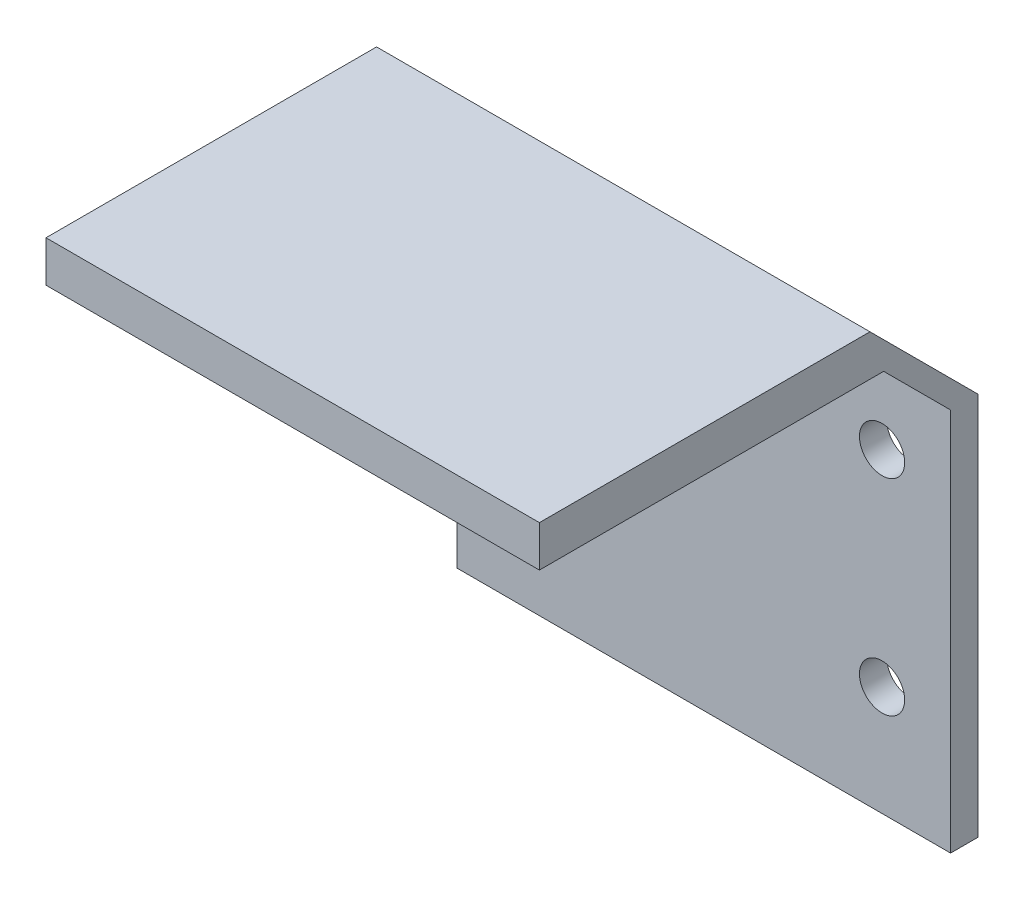
ISO-10303-21;
HEADER;
FILE_DESCRIPTION(('STEP AP214'),'2;1');
FILE_NAME('part.step','',(''),(''),'','','');
FILE_SCHEMA(('AUTOMOTIVE_DESIGN { 1 0 10303 214 1 1 1 1 }'));
ENDSEC;
DATA;
#1=APPLICATION_CONTEXT('core data for automotive mechanical design processes');
#2=APPLICATION_PROTOCOL_DEFINITION('international standard','automotive_design',2000,#1);
#3=PRODUCT_CONTEXT('',#1,'mechanical');
#4=PRODUCT('Part','Part','',(#3));
#5=PRODUCT_RELATED_PRODUCT_CATEGORY('part','',(#4));
#6=PRODUCT_DEFINITION_FORMATION('','',#4);
#7=PRODUCT_DEFINITION_CONTEXT('part definition',#1,'design');
#8=PRODUCT_DEFINITION('design','',#6,#7);
#9=PRODUCT_DEFINITION_SHAPE('','',#8);
#10=(LENGTH_UNIT() NAMED_UNIT(*) SI_UNIT(.MILLI.,.METRE.));
#11=(NAMED_UNIT(*) PLANE_ANGLE_UNIT() SI_UNIT($,.RADIAN.));
#12=(NAMED_UNIT(*) SI_UNIT($,.STERADIAN.) SOLID_ANGLE_UNIT());
#13=UNCERTAINTY_MEASURE_WITH_UNIT(LENGTH_MEASURE(1.E-05),#10,'distance_accuracy_value','');
#14=(GEOMETRIC_REPRESENTATION_CONTEXT(3) GLOBAL_UNCERTAINTY_ASSIGNED_CONTEXT((#13)) GLOBAL_UNIT_ASSIGNED_CONTEXT((#10,
#11,#12)) REPRESENTATION_CONTEXT('',''));
#15=CARTESIAN_POINT('',(0.,0.,0.));
#16=DIRECTION('',(0.,0.,1.));
#17=DIRECTION('',(1.,0.,0.));
#18=AXIS2_PLACEMENT_3D('',#15,#16,#17);
#19=CARTESIAN_POINT('',(0.,0.,2.));
#20=DIRECTION('',(1.,0.,0.));
#21=DIRECTION('',(0.,0.,-1.));
#22=AXIS2_PLACEMENT_3D('',#19,#20,#21);
#23=PLANE('',#22);
#24=DIRECTION('',(0.,-1.,0.));
#25=VECTOR('',#24,1.);
#26=CARTESIAN_POINT('',(0.,0.,0.));
#27=LINE('',#26,#25);
#28=CARTESIAN_POINT('',(0.,28.,0.));
#29=VERTEX_POINT('',#28);
#30=CARTESIAN_POINT('',(0.,0.,0.));
#31=VERTEX_POINT('',#30);
#32=EDGE_CURVE('E79',#29,#31,#27,.T.);
#33=ORIENTED_EDGE('',*,*,#32,.T.);
#34=DIRECTION('',(0.,0.,-1.));
#35=VECTOR('',#34,1.);
#36=CARTESIAN_POINT('',(0.,0.,2.));
#37=LINE('',#36,#35);
#38=CARTESIAN_POINT('',(0.,0.,2.));
#39=VERTEX_POINT('',#38);
#40=EDGE_CURVE('E11',#39,#31,#37,.T.);
#41=ORIENTED_EDGE('',*,*,#40,.F.);
#42=DIRECTION('',(0.,-1.,0.));
#43=VECTOR('',#42,1.);
#44=CARTESIAN_POINT('',(0.,0.,2.));
#45=LINE('',#44,#43);
#46=CARTESIAN_POINT('',(0.,28.,2.));
#47=VERTEX_POINT('',#46);
#48=EDGE_CURVE('E132',#47,#39,#45,.T.);
#49=ORIENTED_EDGE('',*,*,#48,.F.);
#50=DIRECTION('',(0.,-0.707106781186549,-0.707106781186546));
#51=VECTOR('',#50,1.);
#52=CARTESIAN_POINT('',(0.,32.8821219376509,6.88212193765087));
#53=LINE('',#52,#51);
#54=CARTESIAN_POINT('',(0.,32.8821219376509,6.88212193765087));
#55=VERTEX_POINT('',#54);
#56=EDGE_CURVE('E116',#55,#47,#53,.T.);
#57=ORIENTED_EDGE('',*,*,#56,.F.);
#58=DIRECTION('',(0.,0.,-1.));
#59=VECTOR('',#58,1.);
#60=CARTESIAN_POINT('',(0.,32.8821219376509,6.88212193765087));
#61=LINE('',#60,#59);
#62=CARTESIAN_POINT('',(0.,32.8821219376509,32.));
#63=VERTEX_POINT('',#62);
#64=EDGE_CURVE('E129',#63,#55,#61,.T.);
#65=ORIENTED_EDGE('',*,*,#64,.F.);
#66=DIRECTION('',(0.,-1.,0.));
#67=VECTOR('',#66,1.);
#68=CARTESIAN_POINT('',(0.,32.8821219376509,32.));
#69=LINE('',#68,#67);
#70=CARTESIAN_POINT('',(0.,35.8821219376509,32.));
#71=VERTEX_POINT('',#70);
#72=EDGE_CURVE('E124',#71,#63,#69,.T.);
#73=ORIENTED_EDGE('',*,*,#72,.F.);
#74=DIRECTION('',(0.,0.,1.));
#75=VECTOR('',#74,1.);
#76=CARTESIAN_POINT('',(0.,35.8821219376509,32.));
#77=LINE('',#76,#75);
#78=CARTESIAN_POINT('',(0.,35.8821219376509,7.88212193765087));
#79=VERTEX_POINT('',#78);
#80=EDGE_CURVE('E148',#79,#71,#77,.T.);
#81=ORIENTED_EDGE('',*,*,#80,.F.);
#82=DIRECTION('',(0.,0.707106781186549,0.707106781186546));
#83=VECTOR('',#82,1.);
#84=CARTESIAN_POINT('',(0.,35.8821219376509,7.88212193765087));
#85=LINE('',#84,#83);
#86=EDGE_CURVE('E133',#29,#79,#85,.T.);
#87=ORIENTED_EDGE('',*,*,#86,.F.);
#88=EDGE_LOOP('',(#33,#41,#49,#57,#65,#73,#81,#87));
#89=FACE_BOUND('',#88,.T.);
#90=ADVANCED_FACE('F41',(#89),#23,.F.);
#91=CARTESIAN_POINT('',(0.,0.,2.));
#92=DIRECTION('',(0.,1.,0.));
#93=DIRECTION('',(0.,0.,1.));
#94=AXIS2_PLACEMENT_3D('',#91,#92,#93);
#95=PLANE('',#94);
#96=DIRECTION('',(1.,0.,0.));
#97=VECTOR('',#96,1.);
#98=CARTESIAN_POINT('',(0.,0.,0.));
#99=LINE('',#98,#97);
#100=CARTESIAN_POINT('',(36.,0.,0.));
#101=VERTEX_POINT('',#100);
#102=EDGE_CURVE('E72',#31,#101,#99,.T.);
#103=ORIENTED_EDGE('',*,*,#102,.T.);
#104=DIRECTION('',(0.,0.,-1.));
#105=VECTOR('',#104,1.);
#106=CARTESIAN_POINT('',(36.,0.,2.));
#107=LINE('',#106,#105);
#108=CARTESIAN_POINT('',(36.,0.,2.));
#109=VERTEX_POINT('',#108);
#110=EDGE_CURVE('E50',#109,#101,#107,.T.);
#111=ORIENTED_EDGE('',*,*,#110,.F.);
#112=DIRECTION('',(1.,0.,0.));
#113=VECTOR('',#112,1.);
#114=CARTESIAN_POINT('',(0.,0.,2.));
#115=LINE('',#114,#113);
#116=EDGE_CURVE('E84',#39,#109,#115,.T.);
#117=ORIENTED_EDGE('',*,*,#116,.F.);
#118=ORIENTED_EDGE('',*,*,#40,.T.);
#119=EDGE_LOOP('',(#103,#111,#117,#118));
#120=FACE_BOUND('',#119,.T.);
#121=ADVANCED_FACE('F229',(#120),#95,.F.);
#122=CARTESIAN_POINT('',(36.,0.,2.));
#123=DIRECTION('',(-1.,0.,0.));
#124=DIRECTION('',(0.,0.,1.));
#125=AXIS2_PLACEMENT_3D('',#122,#123,#124);
#126=PLANE('',#125);
#127=DIRECTION('',(0.,1.,0.));
#128=VECTOR('',#127,1.);
#129=CARTESIAN_POINT('',(36.,0.,0.));
#130=LINE('',#129,#128);
#131=CARTESIAN_POINT('',(36.,28.,0.));
#132=VERTEX_POINT('',#131);
#133=EDGE_CURVE('E172',#101,#132,#130,.T.);
#134=ORIENTED_EDGE('',*,*,#133,.T.);
#135=DIRECTION('',(0.,0.707106781186549,0.707106781186546));
#136=VECTOR('',#135,1.);
#137=CARTESIAN_POINT('',(36.,35.8821219376509,7.88212193765087));
#138=LINE('',#137,#136);
#139=CARTESIAN_POINT('',(36.,35.8821219376509,7.88212193765087));
#140=VERTEX_POINT('',#139);
#141=EDGE_CURVE('E155',#132,#140,#138,.T.);
#142=ORIENTED_EDGE('',*,*,#141,.T.);
#143=DIRECTION('',(0.,0.,1.));
#144=VECTOR('',#143,1.);
#145=CARTESIAN_POINT('',(36.,35.8821219376509,32.));
#146=LINE('',#145,#144);
#147=CARTESIAN_POINT('',(36.,35.8821219376509,32.));
#148=VERTEX_POINT('',#147);
#149=EDGE_CURVE('E140',#140,#148,#146,.T.);
#150=ORIENTED_EDGE('',*,*,#149,.T.);
#151=DIRECTION('',(0.,-1.,0.));
#152=VECTOR('',#151,1.);
#153=CARTESIAN_POINT('',(36.,32.8821219376509,32.));
#154=LINE('',#153,#152);
#155=CARTESIAN_POINT('',(36.,32.8821219376509,32.));
#156=VERTEX_POINT('',#155);
#157=EDGE_CURVE('E137',#148,#156,#154,.T.);
#158=ORIENTED_EDGE('',*,*,#157,.T.);
#159=DIRECTION('',(0.,0.,-1.));
#160=VECTOR('',#159,1.);
#161=CARTESIAN_POINT('',(36.,32.8821219376509,6.88212193765087));
#162=LINE('',#161,#160);
#163=CARTESIAN_POINT('',(36.,32.8821219376509,6.88212193765087));
#164=VERTEX_POINT('',#163);
#165=EDGE_CURVE('E152',#156,#164,#162,.T.);
#166=ORIENTED_EDGE('',*,*,#165,.T.);
#167=DIRECTION('',(0.,-0.707106781186549,-0.707106781186546));
#168=VECTOR('',#167,1.);
#169=CARTESIAN_POINT('',(36.,32.8821219376509,6.88212193765087));
#170=LINE('',#169,#168);
#171=CARTESIAN_POINT('',(36.,28.,2.));
#172=VERTEX_POINT('',#171);
#173=EDGE_CURVE('E118',#164,#172,#170,.T.);
#174=ORIENTED_EDGE('',*,*,#173,.T.);
#175=DIRECTION('',(0.,1.,0.));
#176=VECTOR('',#175,1.);
#177=CARTESIAN_POINT('',(36.,0.,2.));
#178=LINE('',#177,#176);
#179=EDGE_CURVE('E167',#109,#172,#178,.T.);
#180=ORIENTED_EDGE('',*,*,#179,.F.);
#181=ORIENTED_EDGE('',*,*,#110,.T.);
#182=EDGE_LOOP('',(#134,#142,#150,#158,#166,#174,#180,#181));
#183=FACE_BOUND('',#182,.T.);
#184=ADVANCED_FACE('F224',(#183),#126,.F.);
#185=CARTESIAN_POINT('',(0.,0.,2.));
#186=DIRECTION('',(0.,0.,-1.));
#187=DIRECTION('',(-1.,0.,0.));
#188=AXIS2_PLACEMENT_3D('',#185,#186,#187);
#189=PLANE('',#188);
#190=CARTESIAN_POINT('',(31.0000000000002,8.,2.));
#191=DIRECTION('',(0.,0.,1.));
#192=DIRECTION('',(1.,0.,0.));
#193=AXIS2_PLACEMENT_3D('',#190,#191,#192);
#194=CIRCLE('',#193,1.65);
#195=CARTESIAN_POINT('',(32.6500000000002,8.,2.));
#196=VERTEX_POINT('',#195);
#197=EDGE_CURVE('E217',#196,#196,#194,.T.);
#198=ORIENTED_EDGE('',*,*,#197,.F.);
#199=EDGE_LOOP('',(#198));
#200=FACE_BOUND('',#199,.T.);
#201=CARTESIAN_POINT('',(6.00000000000015,7.99999999999983,2.));
#202=DIRECTION('',(0.,0.,1.));
#203=DIRECTION('',(1.,0.,0.));
#204=AXIS2_PLACEMENT_3D('',#201,#202,#203);
#205=CIRCLE('',#204,1.65);
#206=CARTESIAN_POINT('',(7.65000000000015,7.99999999999983,2.));
#207=VERTEX_POINT('',#206);
#208=EDGE_CURVE('E212',#207,#207,#205,.T.);
#209=ORIENTED_EDGE('',*,*,#208,.F.);
#210=EDGE_LOOP('',(#209));
#211=FACE_BOUND('',#210,.T.);
#212=CARTESIAN_POINT('',(5.99999999999999,22.9999999999998,2.));
#213=DIRECTION('',(0.,0.,1.));
#214=DIRECTION('',(1.,0.,0.));
#215=AXIS2_PLACEMENT_3D('',#212,#213,#214);
#216=CIRCLE('',#215,1.65);
#217=CARTESIAN_POINT('',(7.64999999999999,22.9999999999998,2.));
#218=VERTEX_POINT('',#217);
#219=EDGE_CURVE('E210',#218,#218,#216,.T.);
#220=ORIENTED_EDGE('',*,*,#219,.F.);
#221=EDGE_LOOP('',(#220));
#222=FACE_BOUND('',#221,.T.);
#223=CARTESIAN_POINT('',(31.,23.,2.));
#224=DIRECTION('',(0.,0.,1.));
#225=DIRECTION('',(1.,0.,0.));
#226=AXIS2_PLACEMENT_3D('',#223,#224,#225);
#227=CIRCLE('',#226,1.65);
#228=CARTESIAN_POINT('',(32.65,23.,2.));
#229=VERTEX_POINT('',#228);
#230=EDGE_CURVE('E143',#229,#229,#227,.T.);
#231=ORIENTED_EDGE('',*,*,#230,.F.);
#232=EDGE_LOOP('',(#231));
#233=FACE_BOUND('',#232,.T.);
#234=ORIENTED_EDGE('',*,*,#48,.T.);
#235=ORIENTED_EDGE('',*,*,#116,.T.);
#236=ORIENTED_EDGE('',*,*,#179,.T.);
#237=DIRECTION('',(-1.,0.,0.));
#238=VECTOR('',#237,1.);
#239=CARTESIAN_POINT('',(0.,28.,2.));
#240=LINE('',#239,#238);
#241=EDGE_CURVE('E59',#172,#47,#240,.T.);
#242=ORIENTED_EDGE('',*,*,#241,.T.);
#243=EDGE_LOOP('',(#234,#235,#236,#242));
#244=FACE_BOUND('',#243,.T.);
#245=ADVANCED_FACE('F195',(#200,#211,#222,#233,#244),#189,.F.);
#246=CARTESIAN_POINT('',(0.,0.,0.));
#247=DIRECTION('',(0.,0.,-1.));
#248=DIRECTION('',(-1.,0.,0.));
#249=AXIS2_PLACEMENT_3D('',#246,#247,#248);
#250=PLANE('',#249);
#251=CARTESIAN_POINT('',(31.0000000000002,8.,0.));
#252=DIRECTION('',(0.,0.,-1.));
#253=DIRECTION('',(-1.,0.,0.));
#254=AXIS2_PLACEMENT_3D('',#251,#252,#253);
#255=CIRCLE('',#254,1.65);
#256=CARTESIAN_POINT('',(29.3500000000002,8.,0.));
#257=VERTEX_POINT('',#256);
#258=EDGE_CURVE('E44',#257,#257,#255,.T.);
#259=ORIENTED_EDGE('',*,*,#258,.F.);
#260=EDGE_LOOP('',(#259));
#261=FACE_BOUND('',#260,.T.);
#262=CARTESIAN_POINT('',(6.00000000000015,7.99999999999983,0.));
#263=DIRECTION('',(0.,0.,-1.));
#264=DIRECTION('',(-1.,0.,0.));
#265=AXIS2_PLACEMENT_3D('',#262,#263,#264);
#266=CIRCLE('',#265,1.65);
#267=CARTESIAN_POINT('',(4.35000000000015,7.99999999999983,0.));
#268=VERTEX_POINT('',#267);
#269=EDGE_CURVE('E182',#268,#268,#266,.T.);
#270=ORIENTED_EDGE('',*,*,#269,.F.);
#271=EDGE_LOOP('',(#270));
#272=FACE_BOUND('',#271,.T.);
#273=CARTESIAN_POINT('',(5.99999999999999,22.9999999999998,0.));
#274=DIRECTION('',(0.,0.,-1.));
#275=DIRECTION('',(-1.,0.,0.));
#276=AXIS2_PLACEMENT_3D('',#273,#274,#275);
#277=CIRCLE('',#276,1.65);
#278=CARTESIAN_POINT('',(4.35,22.9999999999998,0.));
#279=VERTEX_POINT('',#278);
#280=EDGE_CURVE('E180',#279,#279,#277,.T.);
#281=ORIENTED_EDGE('',*,*,#280,.F.);
#282=EDGE_LOOP('',(#281));
#283=FACE_BOUND('',#282,.T.);
#284=CARTESIAN_POINT('',(31.,23.,0.));
#285=DIRECTION('',(0.,0.,-1.));
#286=DIRECTION('',(-1.,0.,0.));
#287=AXIS2_PLACEMENT_3D('',#284,#285,#286);
#288=CIRCLE('',#287,1.65);
#289=CARTESIAN_POINT('',(29.35,23.,0.));
#290=VERTEX_POINT('',#289);
#291=EDGE_CURVE('E177',#290,#290,#288,.T.);
#292=ORIENTED_EDGE('',*,*,#291,.F.);
#293=EDGE_LOOP('',(#292));
#294=FACE_BOUND('',#293,.T.);
#295=ORIENTED_EDGE('',*,*,#32,.F.);
#296=DIRECTION('',(-1.,0.,0.));
#297=VECTOR('',#296,1.);
#298=CARTESIAN_POINT('',(0.,28.,0.));
#299=LINE('',#298,#297);
#300=EDGE_CURVE('E165',#132,#29,#299,.T.);
#301=ORIENTED_EDGE('',*,*,#300,.F.);
#302=ORIENTED_EDGE('',*,*,#133,.F.);
#303=ORIENTED_EDGE('',*,*,#102,.F.);
#304=EDGE_LOOP('',(#295,#301,#302,#303));
#305=FACE_BOUND('',#304,.T.);
#306=ADVANCED_FACE('F192',(#261,#272,#283,#294,#305),#250,.T.);
#307=CARTESIAN_POINT('',(0.,32.8821219376509,6.88212193765087));
#308=DIRECTION('',(0.,-1.,0.));
#309=DIRECTION('',(0.,0.,-1.));
#310=AXIS2_PLACEMENT_3D('',#307,#308,#309);
#311=PLANE('',#310);
#312=ORIENTED_EDGE('',*,*,#165,.F.);
#313=DIRECTION('',(1.,0.,0.));
#314=VECTOR('',#313,1.);
#315=CARTESIAN_POINT('',(0.,32.8821219376509,32.));
#316=LINE('',#315,#314);
#317=EDGE_CURVE('E136',#63,#156,#316,.T.);
#318=ORIENTED_EDGE('',*,*,#317,.F.);
#319=ORIENTED_EDGE('',*,*,#64,.T.);
#320=DIRECTION('',(1.,0.,0.));
#321=VECTOR('',#320,1.);
#322=CARTESIAN_POINT('',(0.,32.8821219376509,6.88212193765087));
#323=LINE('',#322,#321);
#324=EDGE_CURVE('E113',#55,#164,#323,.T.);
#325=ORIENTED_EDGE('',*,*,#324,.T.);
#326=EDGE_LOOP('',(#312,#318,#319,#325));
#327=FACE_BOUND('',#326,.T.);
#328=ADVANCED_FACE('F135',(#327),#311,.T.);
#329=CARTESIAN_POINT('',(0.,32.8821219376509,32.));
#330=DIRECTION('',(0.,0.,1.));
#331=DIRECTION('',(1.,0.,0.));
#332=AXIS2_PLACEMENT_3D('',#329,#330,#331);
#333=PLANE('',#332);
#334=ORIENTED_EDGE('',*,*,#157,.F.);
#335=DIRECTION('',(1.,0.,0.));
#336=VECTOR('',#335,1.);
#337=CARTESIAN_POINT('',(0.,35.8821219376509,32.));
#338=LINE('',#337,#336);
#339=EDGE_CURVE('E161',#71,#148,#338,.T.);
#340=ORIENTED_EDGE('',*,*,#339,.F.);
#341=ORIENTED_EDGE('',*,*,#72,.T.);
#342=ORIENTED_EDGE('',*,*,#317,.T.);
#343=EDGE_LOOP('',(#334,#340,#341,#342));
#344=FACE_BOUND('',#343,.T.);
#345=ADVANCED_FACE('F240',(#344),#333,.T.);
#346=CARTESIAN_POINT('',(0.,35.8821219376509,32.));
#347=DIRECTION('',(0.,1.,0.));
#348=DIRECTION('',(0.,0.,1.));
#349=AXIS2_PLACEMENT_3D('',#346,#347,#348);
#350=PLANE('',#349);
#351=ORIENTED_EDGE('',*,*,#149,.F.);
#352=DIRECTION('',(1.,0.,0.));
#353=VECTOR('',#352,1.);
#354=CARTESIAN_POINT('',(0.,35.8821219376509,7.88212193765087));
#355=LINE('',#354,#353);
#356=EDGE_CURVE('E123',#79,#140,#355,.T.);
#357=ORIENTED_EDGE('',*,*,#356,.F.);
#358=ORIENTED_EDGE('',*,*,#80,.T.);
#359=ORIENTED_EDGE('',*,*,#339,.T.);
#360=EDGE_LOOP('',(#351,#357,#358,#359));
#361=FACE_BOUND('',#360,.T.);
#362=ADVANCED_FACE('F246',(#361),#350,.T.);
#363=CARTESIAN_POINT('',(0.,35.8821219376509,7.88212193765087));
#364=DIRECTION('',(0.,0.707106781186546,-0.707106781186548));
#365=DIRECTION('',(0.,0.707106781186549,0.707106781186546));
#366=AXIS2_PLACEMENT_3D('',#363,#364,#365);
#367=PLANE('',#366);
#368=ORIENTED_EDGE('',*,*,#141,.F.);
#369=ORIENTED_EDGE('',*,*,#300,.T.);
#370=ORIENTED_EDGE('',*,*,#86,.T.);
#371=ORIENTED_EDGE('',*,*,#356,.T.);
#372=EDGE_LOOP('',(#368,#369,#370,#371));
#373=FACE_BOUND('',#372,.T.);
#374=ADVANCED_FACE('F243',(#373),#367,.T.);
#375=CARTESIAN_POINT('',(0.,32.8821219376509,6.88212193765087));
#376=DIRECTION('',(0.,-0.707106781186546,0.707106781186549));
#377=DIRECTION('',(0.,-0.707106781186549,-0.707106781186546));
#378=AXIS2_PLACEMENT_3D('',#375,#376,#377);
#379=PLANE('',#378);
#380=ORIENTED_EDGE('',*,*,#173,.F.);
#381=ORIENTED_EDGE('',*,*,#324,.F.);
#382=ORIENTED_EDGE('',*,*,#56,.T.);
#383=ORIENTED_EDGE('',*,*,#241,.F.);
#384=EDGE_LOOP('',(#380,#381,#382,#383));
#385=FACE_BOUND('',#384,.T.);
#386=ADVANCED_FACE('F115',(#385),#379,.T.);
#387=CARTESIAN_POINT('',(31.,23.,-2.));
#388=DIRECTION('',(0.,0.,1.));
#389=DIRECTION('',(1.,0.,0.));
#390=AXIS2_PLACEMENT_3D('',#387,#388,#389);
#391=CYLINDRICAL_SURFACE('',#390,1.65);
#392=ORIENTED_EDGE('',*,*,#291,.T.);
#393=EDGE_LOOP('',(#392));
#394=FACE_BOUND('',#393,.T.);
#395=ORIENTED_EDGE('',*,*,#230,.T.);
#396=EDGE_LOOP('',(#395));
#397=FACE_BOUND('',#396,.T.);
#398=ADVANCED_FACE('F202',(#394,#397),#391,.F.);
#399=CARTESIAN_POINT('',(5.99999999999999,22.9999999999998,-2.));
#400=DIRECTION('',(0.,0.,1.));
#401=DIRECTION('',(1.,0.,0.));
#402=AXIS2_PLACEMENT_3D('',#399,#400,#401);
#403=CYLINDRICAL_SURFACE('',#402,1.65);
#404=ORIENTED_EDGE('',*,*,#280,.T.);
#405=EDGE_LOOP('',(#404));
#406=FACE_BOUND('',#405,.T.);
#407=ORIENTED_EDGE('',*,*,#219,.T.);
#408=EDGE_LOOP('',(#407));
#409=FACE_BOUND('',#408,.T.);
#410=ADVANCED_FACE('F205',(#406,#409),#403,.F.);
#411=CARTESIAN_POINT('',(6.00000000000015,7.99999999999983,-2.));
#412=DIRECTION('',(0.,0.,1.));
#413=DIRECTION('',(1.,0.,0.));
#414=AXIS2_PLACEMENT_3D('',#411,#412,#413);
#415=CYLINDRICAL_SURFACE('',#414,1.65);
#416=ORIENTED_EDGE('',*,*,#269,.T.);
#417=EDGE_LOOP('',(#416));
#418=FACE_BOUND('',#417,.T.);
#419=ORIENTED_EDGE('',*,*,#208,.T.);
#420=EDGE_LOOP('',(#419));
#421=FACE_BOUND('',#420,.T.);
#422=ADVANCED_FACE('F256',(#418,#421),#415,.F.);
#423=CARTESIAN_POINT('',(31.0000000000002,8.,-2.));
#424=DIRECTION('',(0.,0.,1.));
#425=DIRECTION('',(1.,0.,0.));
#426=AXIS2_PLACEMENT_3D('',#423,#424,#425);
#427=CYLINDRICAL_SURFACE('',#426,1.65);
#428=ORIENTED_EDGE('',*,*,#258,.T.);
#429=EDGE_LOOP('',(#428));
#430=FACE_BOUND('',#429,.T.);
#431=ORIENTED_EDGE('',*,*,#197,.T.);
#432=EDGE_LOOP('',(#431));
#433=FACE_BOUND('',#432,.T.);
#434=ADVANCED_FACE('F189',(#430,#433),#427,.F.);
#435=CLOSED_SHELL('',(#90,#121,#184,#245,#306,#328,#345,#362,#374,#386,#398,#410,#422,#434));
#436=MANIFOLD_SOLID_BREP('B2',#435);
#437=ADVANCED_BREP_SHAPE_REPRESENTATION('',(#18,#436),#14);
#438=SHAPE_DEFINITION_REPRESENTATION(#9,#437);
ENDSEC;
END-ISO-10303-21;
